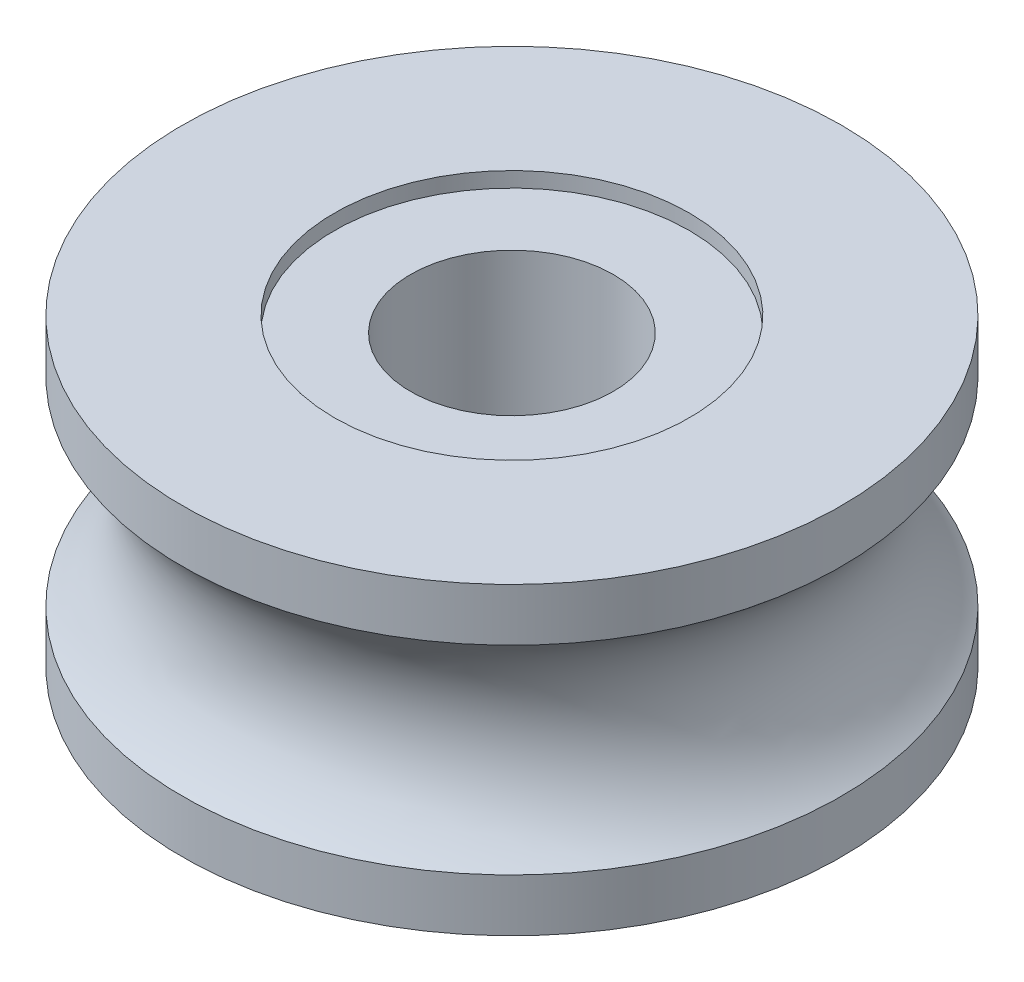
ISO-10303-21;
HEADER;
FILE_DESCRIPTION(('STEP AP214'),'2;1');
FILE_NAME('part.step','',(''),(''),'','','');
FILE_SCHEMA(('AUTOMOTIVE_DESIGN { 1 0 10303 214 1 1 1 1 }'));
ENDSEC;
DATA;
#1=APPLICATION_CONTEXT('core data for automotive mechanical design processes');
#2=APPLICATION_PROTOCOL_DEFINITION('international standard','automotive_design',2000,#1);
#3=PRODUCT_CONTEXT('',#1,'mechanical');
#4=PRODUCT('Part','Part','',(#3));
#5=PRODUCT_RELATED_PRODUCT_CATEGORY('part','',(#4));
#6=PRODUCT_DEFINITION_FORMATION('','',#4);
#7=PRODUCT_DEFINITION_CONTEXT('part definition',#1,'design');
#8=PRODUCT_DEFINITION('design','',#6,#7);
#9=PRODUCT_DEFINITION_SHAPE('','',#8);
#10=(LENGTH_UNIT() NAMED_UNIT(*) SI_UNIT(.MILLI.,.METRE.));
#11=(NAMED_UNIT(*) PLANE_ANGLE_UNIT() SI_UNIT($,.RADIAN.));
#12=(NAMED_UNIT(*) SI_UNIT($,.STERADIAN.) SOLID_ANGLE_UNIT());
#13=UNCERTAINTY_MEASURE_WITH_UNIT(LENGTH_MEASURE(1.E-05),#10,'distance_accuracy_value','');
#14=(GEOMETRIC_REPRESENTATION_CONTEXT(3) GLOBAL_UNCERTAINTY_ASSIGNED_CONTEXT((#13)) GLOBAL_UNIT_ASSIGNED_CONTEXT((#10,
#11,#12)) REPRESENTATION_CONTEXT('',''));
#15=CARTESIAN_POINT('',(0.,0.,0.));
#16=DIRECTION('',(0.,0.,1.));
#17=DIRECTION('',(1.,0.,0.));
#18=AXIS2_PLACEMENT_3D('',#15,#16,#17);
#19=CARTESIAN_POINT('',(3.,-3.85,0.));
#20=DIRECTION('',(0.,-1.,0.));
#21=DIRECTION('',(0.,0.,-1.));
#22=AXIS2_PLACEMENT_3D('',#19,#20,#21);
#23=PLANE('',#22);
#24=CARTESIAN_POINT('',(0.,-3.85,0.));
#25=DIRECTION('',(0.,-1.,0.));
#26=DIRECTION('',(0.,0.,-1.));
#27=AXIS2_PLACEMENT_3D('',#24,#25,#26);
#28=CIRCLE('',#27,3.);
#29=CARTESIAN_POINT('',(0.,-3.85,-3.));
#30=VERTEX_POINT('',#29);
#31=EDGE_CURVE('E10',#30,#30,#28,.T.);
#32=ORIENTED_EDGE('',*,*,#31,.T.);
#33=EDGE_LOOP('',(#32));
#34=FACE_BOUND('',#33,.T.);
#35=CARTESIAN_POINT('',(0.,-3.85,0.));
#36=DIRECTION('',(0.,-1.,0.));
#37=DIRECTION('',(0.,0.,-1.));
#38=AXIS2_PLACEMENT_3D('',#35,#36,#37);
#39=CIRCLE('',#38,2.);
#40=CARTESIAN_POINT('',(0.,-3.85,-2.));
#41=VERTEX_POINT('',#40);
#42=EDGE_CURVE('E82',#41,#41,#39,.T.);
#43=ORIENTED_EDGE('',*,*,#42,.F.);
#44=EDGE_LOOP('',(#43));
#45=FACE_BOUND('',#44,.T.);
#46=ADVANCED_FACE('F39',(#34,#45),#23,.T.);
#47=CARTESIAN_POINT('',(0.,0.,0.));
#48=DIRECTION('',(0.,-1.,0.));
#49=DIRECTION('',(0.,0.,-1.));
#50=AXIS2_PLACEMENT_3D('',#47,#48,#49);
#51=CYLINDRICAL_SURFACE('',#50,3.);
#52=CARTESIAN_POINT('',(0.,-1.85,0.));
#53=DIRECTION('',(0.,-1.,0.));
#54=DIRECTION('',(0.,0.,-1.));
#55=AXIS2_PLACEMENT_3D('',#52,#53,#54);
#56=CIRCLE('',#55,3.);
#57=CARTESIAN_POINT('',(0.,-1.85,-3.));
#58=VERTEX_POINT('',#57);
#59=EDGE_CURVE('E46',#58,#58,#56,.T.);
#60=ORIENTED_EDGE('',*,*,#59,.T.);
#61=EDGE_LOOP('',(#60));
#62=FACE_BOUND('',#61,.T.);
#63=ORIENTED_EDGE('',*,*,#31,.F.);
#64=EDGE_LOOP('',(#63));
#65=FACE_BOUND('',#64,.T.);
#66=ADVANCED_FACE('F91',(#62,#65),#51,.T.);
#67=CARTESIAN_POINT('',(6.5,-1.85,0.));
#68=DIRECTION('',(0.,-1.,0.));
#69=DIRECTION('',(0.,0.,-1.));
#70=AXIS2_PLACEMENT_3D('',#67,#68,#69);
#71=PLANE('',#70);
#72=CARTESIAN_POINT('',(0.,-1.85,0.));
#73=DIRECTION('',(0.,-1.,0.));
#74=DIRECTION('',(0.,0.,-1.));
#75=AXIS2_PLACEMENT_3D('',#72,#73,#74);
#76=CIRCLE('',#75,6.5);
#77=CARTESIAN_POINT('',(0.,-1.85,-6.5));
#78=VERTEX_POINT('',#77);
#79=EDGE_CURVE('E51',#78,#78,#76,.T.);
#80=ORIENTED_EDGE('',*,*,#79,.T.);
#81=EDGE_LOOP('',(#80));
#82=FACE_BOUND('',#81,.T.);
#83=ORIENTED_EDGE('',*,*,#59,.F.);
#84=EDGE_LOOP('',(#83));
#85=FACE_BOUND('',#84,.T.);
#86=ADVANCED_FACE('F95',(#82,#85),#71,.T.);
#87=CARTESIAN_POINT('',(0.,0.,0.));
#88=DIRECTION('',(0.,-1.,0.));
#89=DIRECTION('',(0.,0.,-1.));
#90=AXIS2_PLACEMENT_3D('',#87,#88,#89);
#91=CYLINDRICAL_SURFACE('',#90,6.5);
#92=CARTESIAN_POINT('',(0.,-0.811504524593303,0.));
#93=DIRECTION('',(0.,-1.,0.));
#94=DIRECTION('',(0.,0.,-1.));
#95=AXIS2_PLACEMENT_3D('',#92,#93,#94);
#96=CIRCLE('',#95,6.5);
#97=CARTESIAN_POINT('',(0.,-0.811504524593303,-6.5));
#98=VERTEX_POINT('',#97);
#99=EDGE_CURVE('E56',#98,#98,#96,.T.);
#100=ORIENTED_EDGE('',*,*,#99,.T.);
#101=EDGE_LOOP('',(#100));
#102=FACE_BOUND('',#101,.T.);
#103=ORIENTED_EDGE('',*,*,#79,.F.);
#104=EDGE_LOOP('',(#103));
#105=FACE_BOUND('',#104,.T.);
#106=ADVANCED_FACE('F99',(#102,#105),#91,.T.);
#107=CARTESIAN_POINT('',(0.,1.15,0.));
#108=DIRECTION('',(0.,-1.,0.));
#109=DIRECTION('',(0.,0.,-1.));
#110=AXIS2_PLACEMENT_3D('',#107,#108,#109);
#111=TOROIDAL_SURFACE('',#110,8.05,2.5);
#112=CARTESIAN_POINT('',(0.,3.1115045245933,0.));
#113=DIRECTION('',(0.,-1.,0.));
#114=DIRECTION('',(0.,0.,-1.));
#115=AXIS2_PLACEMENT_3D('',#112,#113,#114);
#116=CIRCLE('',#115,6.5);
#117=CARTESIAN_POINT('',(0.,3.1115045245933,-6.5));
#118=VERTEX_POINT('',#117);
#119=EDGE_CURVE('E62',#118,#118,#116,.T.);
#120=ORIENTED_EDGE('',*,*,#119,.T.);
#121=EDGE_LOOP('',(#120));
#122=FACE_BOUND('',#121,.T.);
#123=ORIENTED_EDGE('',*,*,#99,.F.);
#124=EDGE_LOOP('',(#123));
#125=FACE_BOUND('',#124,.T.);
#126=ADVANCED_FACE('F106',(#122,#125),#111,.F.);
#127=CARTESIAN_POINT('',(0.,0.,0.));
#128=DIRECTION('',(0.,-1.,0.));
#129=DIRECTION('',(0.,0.,-1.));
#130=AXIS2_PLACEMENT_3D('',#127,#128,#129);
#131=CYLINDRICAL_SURFACE('',#130,6.5);
#132=CARTESIAN_POINT('',(0.,4.15,0.));
#133=DIRECTION('',(0.,-1.,0.));
#134=DIRECTION('',(0.,0.,-1.));
#135=AXIS2_PLACEMENT_3D('',#132,#133,#134);
#136=CIRCLE('',#135,6.5);
#137=CARTESIAN_POINT('',(0.,4.15,-6.5));
#138=VERTEX_POINT('',#137);
#139=EDGE_CURVE('E66',#138,#138,#136,.T.);
#140=ORIENTED_EDGE('',*,*,#139,.T.);
#141=EDGE_LOOP('',(#140));
#142=FACE_BOUND('',#141,.T.);
#143=ORIENTED_EDGE('',*,*,#119,.F.);
#144=EDGE_LOOP('',(#143));
#145=FACE_BOUND('',#144,.T.);
#146=ADVANCED_FACE('F110',(#142,#145),#131,.T.);
#147=CARTESIAN_POINT('',(6.5,4.15,0.));
#148=DIRECTION('',(0.,1.,0.));
#149=DIRECTION('',(0.,0.,1.));
#150=AXIS2_PLACEMENT_3D('',#147,#148,#149);
#151=PLANE('',#150);
#152=CARTESIAN_POINT('',(0.,4.15,0.));
#153=DIRECTION('',(0.,-1.,0.));
#154=DIRECTION('',(0.,0.,-1.));
#155=AXIS2_PLACEMENT_3D('',#152,#153,#154);
#156=CIRCLE('',#155,3.5);
#157=CARTESIAN_POINT('',(0.,4.15,-3.5));
#158=VERTEX_POINT('',#157);
#159=EDGE_CURVE('E70',#158,#158,#156,.T.);
#160=ORIENTED_EDGE('',*,*,#159,.T.);
#161=EDGE_LOOP('',(#160));
#162=FACE_BOUND('',#161,.T.);
#163=ORIENTED_EDGE('',*,*,#139,.F.);
#164=EDGE_LOOP('',(#163));
#165=FACE_BOUND('',#164,.T.);
#166=ADVANCED_FACE('F114',(#162,#165),#151,.T.);
#167=CARTESIAN_POINT('',(0.,0.,0.));
#168=DIRECTION('',(0.,-1.,0.));
#169=DIRECTION('',(0.,0.,-1.));
#170=AXIS2_PLACEMENT_3D('',#167,#168,#169);
#171=CYLINDRICAL_SURFACE('',#170,3.5);
#172=CARTESIAN_POINT('',(0.,3.85,0.));
#173=DIRECTION('',(0.,-1.,0.));
#174=DIRECTION('',(0.,0.,-1.));
#175=AXIS2_PLACEMENT_3D('',#172,#173,#174);
#176=CIRCLE('',#175,3.5);
#177=CARTESIAN_POINT('',(0.,3.85,-3.5));
#178=VERTEX_POINT('',#177);
#179=EDGE_CURVE('E74',#178,#178,#176,.T.);
#180=ORIENTED_EDGE('',*,*,#179,.T.);
#181=EDGE_LOOP('',(#180));
#182=FACE_BOUND('',#181,.T.);
#183=ORIENTED_EDGE('',*,*,#159,.F.);
#184=EDGE_LOOP('',(#183));
#185=FACE_BOUND('',#184,.T.);
#186=ADVANCED_FACE('F118',(#182,#185),#171,.F.);
#187=CARTESIAN_POINT('',(3.5,3.85,0.));
#188=DIRECTION('',(0.,1.,0.));
#189=DIRECTION('',(0.,0.,1.));
#190=AXIS2_PLACEMENT_3D('',#187,#188,#189);
#191=PLANE('',#190);
#192=CARTESIAN_POINT('',(0.,3.85,0.));
#193=DIRECTION('',(0.,-1.,0.));
#194=DIRECTION('',(0.,0.,-1.));
#195=AXIS2_PLACEMENT_3D('',#192,#193,#194);
#196=CIRCLE('',#195,2.);
#197=CARTESIAN_POINT('',(0.,3.85,-2.));
#198=VERTEX_POINT('',#197);
#199=EDGE_CURVE('E78',#198,#198,#196,.T.);
#200=ORIENTED_EDGE('',*,*,#199,.T.);
#201=EDGE_LOOP('',(#200));
#202=FACE_BOUND('',#201,.T.);
#203=ORIENTED_EDGE('',*,*,#179,.F.);
#204=EDGE_LOOP('',(#203));
#205=FACE_BOUND('',#204,.T.);
#206=ADVANCED_FACE('F122',(#202,#205),#191,.T.);
#207=CARTESIAN_POINT('',(0.,0.,0.));
#208=DIRECTION('',(0.,-1.,0.));
#209=DIRECTION('',(0.,0.,-1.));
#210=AXIS2_PLACEMENT_3D('',#207,#208,#209);
#211=CYLINDRICAL_SURFACE('',#210,2.);
#212=ORIENTED_EDGE('',*,*,#42,.T.);
#213=EDGE_LOOP('',(#212));
#214=FACE_BOUND('',#213,.T.);
#215=ORIENTED_EDGE('',*,*,#199,.F.);
#216=EDGE_LOOP('',(#215));
#217=FACE_BOUND('',#216,.T.);
#218=ADVANCED_FACE('F87',(#214,#217),#211,.F.);
#219=CLOSED_SHELL('',(#46,#66,#86,#106,#126,#146,#166,#186,#206,#218));
#220=MANIFOLD_SOLID_BREP('B2',#219);
#221=ADVANCED_BREP_SHAPE_REPRESENTATION('',(#18,#220),#14);
#222=SHAPE_DEFINITION_REPRESENTATION(#9,#221);
ENDSEC;
END-ISO-10303-21;
